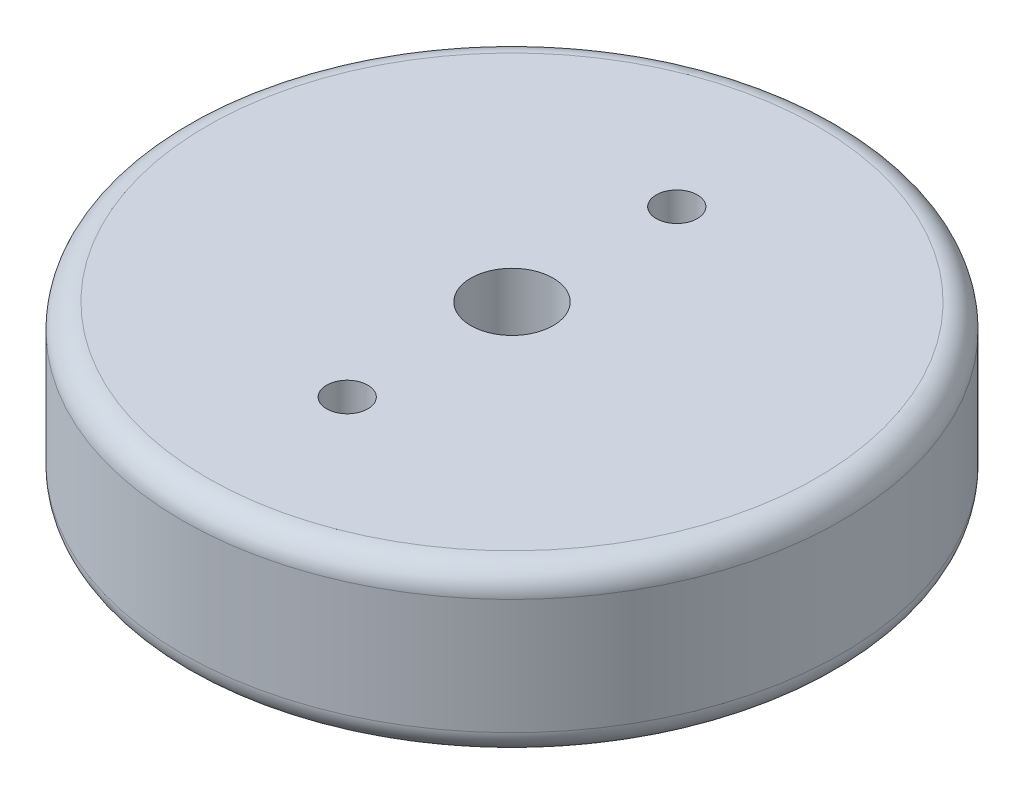
ISO-10303-21;
HEADER;
FILE_DESCRIPTION(('STEP AP214'),'2;1');
FILE_NAME('part.step','',(''),(''),'','','');
FILE_SCHEMA(('AUTOMOTIVE_DESIGN { 1 0 10303 214 1 1 1 1 }'));
ENDSEC;
DATA;
#1=APPLICATION_CONTEXT('core data for automotive mechanical design processes');
#2=APPLICATION_PROTOCOL_DEFINITION('international standard','automotive_design',2000,#1);
#3=PRODUCT_CONTEXT('',#1,'mechanical');
#4=PRODUCT('Part','Part','',(#3));
#5=PRODUCT_RELATED_PRODUCT_CATEGORY('part','',(#4));
#6=PRODUCT_DEFINITION_FORMATION('','',#4);
#7=PRODUCT_DEFINITION_CONTEXT('part definition',#1,'design');
#8=PRODUCT_DEFINITION('design','',#6,#7);
#9=PRODUCT_DEFINITION_SHAPE('','',#8);
#10=(LENGTH_UNIT() NAMED_UNIT(*) SI_UNIT(.MILLI.,.METRE.));
#11=(NAMED_UNIT(*) PLANE_ANGLE_UNIT() SI_UNIT($,.RADIAN.));
#12=(NAMED_UNIT(*) SI_UNIT($,.STERADIAN.) SOLID_ANGLE_UNIT());
#13=UNCERTAINTY_MEASURE_WITH_UNIT(LENGTH_MEASURE(1.E-05),#10,'distance_accuracy_value','');
#14=(GEOMETRIC_REPRESENTATION_CONTEXT(3) GLOBAL_UNCERTAINTY_ASSIGNED_CONTEXT((#13)) GLOBAL_UNIT_ASSIGNED_CONTEXT((#10,
#11,#12)) REPRESENTATION_CONTEXT('',''));
#15=CARTESIAN_POINT('',(0.,0.,0.));
#16=DIRECTION('',(0.,0.,1.));
#17=DIRECTION('',(1.,0.,0.));
#18=AXIS2_PLACEMENT_3D('',#15,#16,#17);
#19=CARTESIAN_POINT('',(0.,20.,0.));
#20=DIRECTION('',(0.,1.,0.));
#21=DIRECTION('',(0.,0.,1.));
#22=AXIS2_PLACEMENT_3D('',#19,#20,#21);
#23=PLANE('',#22);
#24=CARTESIAN_POINT('',(0.,20.,-20.));
#25=DIRECTION('',(0.,1.,0.));
#26=DIRECTION('',(0.,0.,1.));
#27=AXIS2_PLACEMENT_3D('',#24,#25,#26);
#28=CIRCLE('',#27,2.5);
#29=CARTESIAN_POINT('',(0.,20.,-17.5));
#30=VERTEX_POINT('',#29);
#31=EDGE_CURVE('E64',#30,#30,#28,.T.);
#32=ORIENTED_EDGE('',*,*,#31,.F.);
#33=EDGE_LOOP('',(#32));
#34=FACE_BOUND('',#33,.T.);
#35=CARTESIAN_POINT('',(0.,20.,20.));
#36=DIRECTION('',(0.,1.,0.));
#37=DIRECTION('',(0.,0.,1.));
#38=AXIS2_PLACEMENT_3D('',#35,#36,#37);
#39=CIRCLE('',#38,2.5);
#40=CARTESIAN_POINT('',(0.,20.,22.5));
#41=VERTEX_POINT('',#40);
#42=EDGE_CURVE('E58',#41,#41,#39,.T.);
#43=ORIENTED_EDGE('',*,*,#42,.F.);
#44=EDGE_LOOP('',(#43));
#45=FACE_BOUND('',#44,.T.);
#46=CARTESIAN_POINT('',(0.,20.,0.));
#47=DIRECTION('',(0.,1.,0.));
#48=DIRECTION('',(0.,0.,1.));
#49=AXIS2_PLACEMENT_3D('',#46,#47,#48);
#50=CIRCLE('',#49,37.);
#51=CARTESIAN_POINT('',(0.,20.,37.));
#52=VERTEX_POINT('',#51);
#53=EDGE_CURVE('E10',#52,#52,#50,.T.);
#54=ORIENTED_EDGE('',*,*,#53,.T.);
#55=EDGE_LOOP('',(#54));
#56=FACE_BOUND('',#55,.T.);
#57=CARTESIAN_POINT('',(0.,20.,0.));
#58=DIRECTION('',(0.,1.,0.));
#59=DIRECTION('',(0.,0.,1.));
#60=AXIS2_PLACEMENT_3D('',#57,#58,#59);
#61=CIRCLE('',#60,5.);
#62=CARTESIAN_POINT('',(0.,20.,5.));
#63=VERTEX_POINT('',#62);
#64=EDGE_CURVE('E51',#63,#63,#61,.T.);
#65=ORIENTED_EDGE('',*,*,#64,.F.);
#66=EDGE_LOOP('',(#65));
#67=FACE_BOUND('',#66,.T.);
#68=ADVANCED_FACE('F31',(#34,#45,#56,#67),#23,.T.);
#69=CARTESIAN_POINT('',(0.,0.,0.));
#70=DIRECTION('',(0.,1.,0.));
#71=DIRECTION('',(0.,0.,1.));
#72=AXIS2_PLACEMENT_3D('',#69,#70,#71);
#73=PLANE('',#72);
#74=CARTESIAN_POINT('',(0.,0.,-20.));
#75=DIRECTION('',(0.,1.,0.));
#76=DIRECTION('',(0.,0.,1.));
#77=AXIS2_PLACEMENT_3D('',#74,#75,#76);
#78=CIRCLE('',#77,2.5);
#79=CARTESIAN_POINT('',(0.,0.,-17.5));
#80=VERTEX_POINT('',#79);
#81=EDGE_CURVE('E55',#80,#80,#78,.T.);
#82=ORIENTED_EDGE('',*,*,#81,.T.);
#83=EDGE_LOOP('',(#82));
#84=FACE_BOUND('',#83,.T.);
#85=CARTESIAN_POINT('',(0.,0.,20.));
#86=DIRECTION('',(0.,1.,0.));
#87=DIRECTION('',(0.,0.,1.));
#88=AXIS2_PLACEMENT_3D('',#85,#86,#87);
#89=CIRCLE('',#88,2.5);
#90=CARTESIAN_POINT('',(0.,0.,22.5));
#91=VERTEX_POINT('',#90);
#92=EDGE_CURVE('E61',#91,#91,#89,.T.);
#93=ORIENTED_EDGE('',*,*,#92,.T.);
#94=EDGE_LOOP('',(#93));
#95=FACE_BOUND('',#94,.T.);
#96=CARTESIAN_POINT('',(0.,0.,0.));
#97=DIRECTION('',(0.,1.,0.));
#98=DIRECTION('',(0.,0.,1.));
#99=AXIS2_PLACEMENT_3D('',#96,#97,#98);
#100=CIRCLE('',#99,37.);
#101=CARTESIAN_POINT('',(0.,0.,37.));
#102=VERTEX_POINT('',#101);
#103=EDGE_CURVE('E38',#102,#102,#100,.F.);
#104=ORIENTED_EDGE('',*,*,#103,.T.);
#105=EDGE_LOOP('',(#104));
#106=FACE_BOUND('',#105,.T.);
#107=CARTESIAN_POINT('',(0.,0.,0.));
#108=DIRECTION('',(0.,1.,0.));
#109=DIRECTION('',(0.,0.,1.));
#110=AXIS2_PLACEMENT_3D('',#107,#108,#109);
#111=CIRCLE('',#110,5.);
#112=CARTESIAN_POINT('',(0.,0.,5.));
#113=VERTEX_POINT('',#112);
#114=EDGE_CURVE('E52',#113,#113,#111,.T.);
#115=ORIENTED_EDGE('',*,*,#114,.T.);
#116=EDGE_LOOP('',(#115));
#117=FACE_BOUND('',#116,.T.);
#118=ADVANCED_FACE('F70',(#84,#95,#106,#117),#73,.F.);
#119=CARTESIAN_POINT('',(0.,20.,0.));
#120=DIRECTION('',(0.,-1.,0.));
#121=DIRECTION('',(0.,0.,-1.));
#122=AXIS2_PLACEMENT_3D('',#119,#120,#121);
#123=CYLINDRICAL_SURFACE('',#122,40.);
#124=CARTESIAN_POINT('',(0.,3.,0.));
#125=DIRECTION('',(0.,1.,0.));
#126=DIRECTION('',(0.,0.,1.));
#127=AXIS2_PLACEMENT_3D('',#124,#125,#126);
#128=CIRCLE('',#127,40.);
#129=CARTESIAN_POINT('',(0.,3.,40.));
#130=VERTEX_POINT('',#129);
#131=EDGE_CURVE('E42',#130,#130,#128,.T.);
#132=ORIENTED_EDGE('',*,*,#131,.T.);
#133=EDGE_LOOP('',(#132));
#134=FACE_BOUND('',#133,.T.);
#135=CARTESIAN_POINT('',(0.,17.,0.));
#136=DIRECTION('',(0.,1.,0.));
#137=DIRECTION('',(0.,0.,1.));
#138=AXIS2_PLACEMENT_3D('',#135,#136,#137);
#139=CIRCLE('',#138,40.);
#140=CARTESIAN_POINT('',(0.,17.,40.));
#141=VERTEX_POINT('',#140);
#142=EDGE_CURVE('E46',#141,#141,#139,.F.);
#143=ORIENTED_EDGE('',*,*,#142,.T.);
#144=EDGE_LOOP('',(#143));
#145=FACE_BOUND('',#144,.T.);
#146=ADVANCED_FACE('F91',(#134,#145),#123,.T.);
#147=CARTESIAN_POINT('',(0.,20.,0.));
#148=DIRECTION('',(0.,-1.,0.));
#149=DIRECTION('',(0.,0.,-1.));
#150=AXIS2_PLACEMENT_3D('',#147,#148,#149);
#151=CYLINDRICAL_SURFACE('',#150,5.);
#152=ORIENTED_EDGE('',*,*,#64,.T.);
#153=EDGE_LOOP('',(#152));
#154=FACE_BOUND('',#153,.T.);
#155=ORIENTED_EDGE('',*,*,#114,.F.);
#156=EDGE_LOOP('',(#155));
#157=FACE_BOUND('',#156,.T.);
#158=ADVANCED_FACE('F87',(#154,#157),#151,.F.);
#159=CARTESIAN_POINT('',(0.,3.,0.));
#160=DIRECTION('',(0.,1.,0.));
#161=DIRECTION('',(0.,0.,1.));
#162=AXIS2_PLACEMENT_3D('',#159,#160,#161);
#163=TOROIDAL_SURFACE('',#162,37.,3.);
#164=ORIENTED_EDGE('',*,*,#103,.F.);
#165=EDGE_LOOP('',(#164));
#166=FACE_BOUND('',#165,.T.);
#167=ORIENTED_EDGE('',*,*,#131,.F.);
#168=EDGE_LOOP('',(#167));
#169=FACE_BOUND('',#168,.T.);
#170=ADVANCED_FACE('F90',(#166,#169),#163,.T.);
#171=CARTESIAN_POINT('',(0.,17.,0.));
#172=DIRECTION('',(0.,1.,0.));
#173=DIRECTION('',(0.,0.,1.));
#174=AXIS2_PLACEMENT_3D('',#171,#172,#173);
#175=TOROIDAL_SURFACE('',#174,37.,3.);
#176=ORIENTED_EDGE('',*,*,#142,.F.);
#177=EDGE_LOOP('',(#176));
#178=FACE_BOUND('',#177,.T.);
#179=ORIENTED_EDGE('',*,*,#53,.F.);
#180=EDGE_LOOP('',(#179));
#181=FACE_BOUND('',#180,.T.);
#182=ADVANCED_FACE('F33',(#178,#181),#175,.T.);
#183=CARTESIAN_POINT('',(0.,0.,20.));
#184=DIRECTION('',(0.,1.,0.));
#185=DIRECTION('',(0.,0.,1.));
#186=AXIS2_PLACEMENT_3D('',#183,#184,#185);
#187=CYLINDRICAL_SURFACE('',#186,2.5);
#188=ORIENTED_EDGE('',*,*,#92,.F.);
#189=EDGE_LOOP('',(#188));
#190=FACE_BOUND('',#189,.T.);
#191=ORIENTED_EDGE('',*,*,#42,.T.);
#192=EDGE_LOOP('',(#191));
#193=FACE_BOUND('',#192,.T.);
#194=ADVANCED_FACE('F76',(#190,#193),#187,.F.);
#195=CARTESIAN_POINT('',(0.,0.,-20.));
#196=DIRECTION('',(0.,1.,0.));
#197=DIRECTION('',(0.,0.,1.));
#198=AXIS2_PLACEMENT_3D('',#195,#196,#197);
#199=CYLINDRICAL_SURFACE('',#198,2.5);
#200=ORIENTED_EDGE('',*,*,#81,.F.);
#201=EDGE_LOOP('',(#200));
#202=FACE_BOUND('',#201,.T.);
#203=ORIENTED_EDGE('',*,*,#31,.T.);
#204=EDGE_LOOP('',(#203));
#205=FACE_BOUND('',#204,.T.);
#206=ADVANCED_FACE('F73',(#202,#205),#199,.F.);
#207=CLOSED_SHELL('',(#68,#118,#146,#158,#170,#182,#194,#206));
#208=MANIFOLD_SOLID_BREP('B2',#207);
#209=ADVANCED_BREP_SHAPE_REPRESENTATION('',(#18,#208),#14);
#210=SHAPE_DEFINITION_REPRESENTATION(#9,#209);
ENDSEC;
END-ISO-10303-21;
